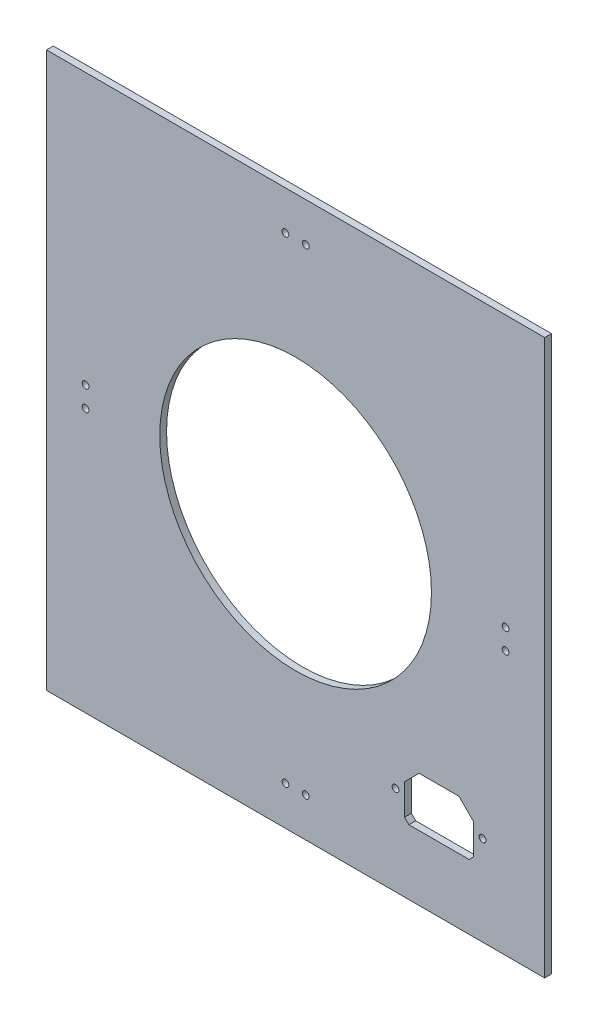
ISO-10303-21;
HEADER;
FILE_DESCRIPTION(('STEP AP214'),'2;1');
FILE_NAME('part.step','',(''),(''),'','','');
FILE_SCHEMA(('AUTOMOTIVE_DESIGN { 1 0 10303 214 1 1 1 1 }'));
ENDSEC;
DATA;
#1=APPLICATION_CONTEXT('core data for automotive mechanical design processes');
#2=APPLICATION_PROTOCOL_DEFINITION('international standard','automotive_design',2000,#1);
#3=PRODUCT_CONTEXT('',#1,'mechanical');
#4=PRODUCT('Part','Part','',(#3));
#5=PRODUCT_RELATED_PRODUCT_CATEGORY('part','',(#4));
#6=PRODUCT_DEFINITION_FORMATION('','',#4);
#7=PRODUCT_DEFINITION_CONTEXT('part definition',#1,'design');
#8=PRODUCT_DEFINITION('design','',#6,#7);
#9=PRODUCT_DEFINITION_SHAPE('','',#8);
#10=(LENGTH_UNIT() NAMED_UNIT(*) SI_UNIT(.MILLI.,.METRE.));
#11=(NAMED_UNIT(*) PLANE_ANGLE_UNIT() SI_UNIT($,.RADIAN.));
#12=(NAMED_UNIT(*) SI_UNIT($,.STERADIAN.) SOLID_ANGLE_UNIT());
#13=UNCERTAINTY_MEASURE_WITH_UNIT(LENGTH_MEASURE(1.E-05),#10,'distance_accuracy_value','');
#14=(GEOMETRIC_REPRESENTATION_CONTEXT(3) GLOBAL_UNCERTAINTY_ASSIGNED_CONTEXT((#13)) GLOBAL_UNIT_ASSIGNED_CONTEXT((#10,
#11,#12)) REPRESENTATION_CONTEXT('',''));
#15=CARTESIAN_POINT('',(0.,0.,0.));
#16=DIRECTION('',(0.,0.,1.));
#17=DIRECTION('',(1.,0.,0.));
#18=AXIS2_PLACEMENT_3D('',#15,#16,#17);
#19=CARTESIAN_POINT('',(0.,0.,3.));
#20=DIRECTION('',(0.,0.,-1.));
#21=DIRECTION('',(-1.,0.,0.));
#22=AXIS2_PLACEMENT_3D('',#19,#20,#21);
#23=PLANE('',#22);
#24=CARTESIAN_POINT('',(-12.2529511768823,-1.47301526717697,3.));
#25=DIRECTION('',(0.,0.,-1.));
#26=DIRECTION('',(-1.,0.,0.));
#27=AXIS2_PLACEMENT_3D('',#24,#25,#26);
#28=CIRCLE('',#27,1.49999999999997);
#29=CARTESIAN_POINT('',(-13.7529511768823,-1.47301526717697,3.));
#30=VERTEX_POINT('',#29);
#31=EDGE_CURVE('E155',#30,#30,#28,.F.);
#32=ORIENTED_EDGE('',*,*,#31,.F.);
#33=EDGE_LOOP('',(#32));
#34=FACE_BOUND('',#33,.T.);
#35=CARTESIAN_POINT('',(-109.5,-100.705064090293,3.));
#36=DIRECTION('',(0.,0.,-1.));
#37=DIRECTION('',(-1.,0.,0.));
#38=AXIS2_PLACEMENT_3D('',#35,#36,#37);
#39=CIRCLE('',#38,1.49999999999997);
#40=CARTESIAN_POINT('',(-111.,-100.705064090293,3.));
#41=VERTEX_POINT('',#40);
#42=EDGE_CURVE('E267',#41,#41,#39,.T.);
#43=ORIENTED_EDGE('',*,*,#42,.T.);
#44=EDGE_LOOP('',(#43));
#45=FACE_BOUND('',#44,.T.);
#46=CARTESIAN_POINT('',(-197.747048823118,-1.47301526717697,3.));
#47=DIRECTION('',(0.,0.,-1.));
#48=DIRECTION('',(-1.,0.,0.));
#49=AXIS2_PLACEMENT_3D('',#46,#47,#48);
#50=CIRCLE('',#49,1.49999999999997);
#51=CARTESIAN_POINT('',(-199.247048823118,-1.47301526717697,3.));
#52=VERTEX_POINT('',#51);
#53=EDGE_CURVE('E272',#52,#52,#50,.T.);
#54=ORIENTED_EDGE('',*,*,#53,.T.);
#55=EDGE_LOOP('',(#54));
#56=FACE_BOUND('',#55,.T.);
#57=CARTESIAN_POINT('',(-109.5,109.789033555942,3.));
#58=DIRECTION('',(0.,0.,-1.));
#59=DIRECTION('',(-1.,0.,0.));
#60=AXIS2_PLACEMENT_3D('',#57,#58,#59);
#61=CIRCLE('',#60,1.49999999999997);
#62=CARTESIAN_POINT('',(-111.,109.789033555942,3.));
#63=VERTEX_POINT('',#62);
#64=EDGE_CURVE('E275',#63,#63,#61,.F.);
#65=ORIENTED_EDGE('',*,*,#64,.F.);
#66=EDGE_LOOP('',(#65));
#67=FACE_BOUND('',#66,.T.);
#68=CARTESIAN_POINT('',(-100.5,109.789033555942,3.));
#69=DIRECTION('',(0.,0.,-1.));
#70=DIRECTION('',(-1.,0.,0.));
#71=AXIS2_PLACEMENT_3D('',#68,#69,#70);
#72=CIRCLE('',#71,1.49999999999997);
#73=CARTESIAN_POINT('',(-102.,109.789033555942,3.));
#74=VERTEX_POINT('',#73);
#75=EDGE_CURVE('E278',#74,#74,#72,.F.);
#76=ORIENTED_EDGE('',*,*,#75,.F.);
#77=EDGE_LOOP('',(#76));
#78=FACE_BOUND('',#77,.T.);
#79=CARTESIAN_POINT('',(-12.2529511768823,7.52698473282304,3.));
#80=DIRECTION('',(0.,0.,-1.));
#81=DIRECTION('',(-1.,0.,0.));
#82=AXIS2_PLACEMENT_3D('',#79,#80,#81);
#83=CIRCLE('',#82,1.49999999999997);
#84=CARTESIAN_POINT('',(-13.7529511768823,7.52698473282304,3.));
#85=VERTEX_POINT('',#84);
#86=EDGE_CURVE('E281',#85,#85,#83,.F.);
#87=ORIENTED_EDGE('',*,*,#86,.F.);
#88=EDGE_LOOP('',(#87));
#89=FACE_BOUND('',#88,.T.);
#90=CARTESIAN_POINT('',(-60.8634487757194,-78.3416070210696,3.));
#91=DIRECTION('',(0.,0.,1.));
#92=DIRECTION('',(1.,0.,0.));
#93=AXIS2_PLACEMENT_3D('',#90,#91,#92);
#94=CIRCLE('',#93,1.5);
#95=CARTESIAN_POINT('',(-59.3634487757194,-78.3416070210696,3.));
#96=VERTEX_POINT('',#95);
#97=EDGE_CURVE('E177',#96,#96,#94,.T.);
#98=ORIENTED_EDGE('',*,*,#97,.F.);
#99=EDGE_LOOP('',(#98));
#100=FACE_BOUND('',#99,.T.);
#101=CARTESIAN_POINT('',(-22.442633495548,-78.3416070210696,3.));
#102=DIRECTION('',(0.,0.,1.));
#103=DIRECTION('',(1.,0.,0.));
#104=AXIS2_PLACEMENT_3D('',#101,#102,#103);
#105=CIRCLE('',#104,1.5);
#106=CARTESIAN_POINT('',(-20.942633495548,-78.3416070210696,3.));
#107=VERTEX_POINT('',#106);
#108=EDGE_CURVE('E173',#107,#107,#105,.T.);
#109=ORIENTED_EDGE('',*,*,#108,.F.);
#110=EDGE_LOOP('',(#109));
#111=FACE_BOUND('',#110,.T.);
#112=DIRECTION('',(1.,0.,0.));
#113=VECTOR('',#112,1.);
#114=CARTESIAN_POINT('',(-210.,-117.958015267176,3.));
#115=LINE('',#114,#113);
#116=CARTESIAN_POINT('',(-215.,-117.958015267176,3.));
#117=VERTEX_POINT('',#116);
#118=CARTESIAN_POINT('',(5.,-117.958015267176,3.));
#119=VERTEX_POINT('',#118);
#120=EDGE_CURVE('E11',#117,#119,#115,.T.);
#121=ORIENTED_EDGE('',*,*,#120,.T.);
#122=DIRECTION('',(0.,-1.,0.));
#123=VECTOR('',#122,1.);
#124=CARTESIAN_POINT('',(5.,127.041984732824,3.));
#125=LINE('',#124,#123);
#126=CARTESIAN_POINT('',(5.,127.041984732824,3.));
#127=VERTEX_POINT('',#126);
#128=EDGE_CURVE('E170',#127,#119,#125,.T.);
#129=ORIENTED_EDGE('',*,*,#128,.F.);
#130=DIRECTION('',(-1.,0.,0.));
#131=VECTOR('',#130,1.);
#132=CARTESIAN_POINT('',(-210.,127.041984732824,3.));
#133=LINE('',#132,#131);
#134=CARTESIAN_POINT('',(-215.,127.041984732824,3.));
#135=VERTEX_POINT('',#134);
#136=EDGE_CURVE('E50',#127,#135,#133,.T.);
#137=ORIENTED_EDGE('',*,*,#136,.T.);
#138=DIRECTION('',(0.,1.,0.));
#139=VECTOR('',#138,1.);
#140=CARTESIAN_POINT('',(-215.,-117.958015267176,3.));
#141=LINE('',#140,#139);
#142=EDGE_CURVE('E154',#117,#135,#141,.T.);
#143=ORIENTED_EDGE('',*,*,#142,.F.);
#144=EDGE_LOOP('',(#121,#129,#137,#143));
#145=FACE_BOUND('',#144,.T.);
#146=CARTESIAN_POINT('',(-105.,4.54198473282444,3.));
#147=DIRECTION('',(0.,0.,1.));
#148=DIRECTION('',(1.,0.,0.));
#149=AXIS2_PLACEMENT_3D('',#146,#147,#148);
#150=CIRCLE('',#149,60.);
#151=CARTESIAN_POINT('',(-45.,4.54198473282444,3.));
#152=VERTEX_POINT('',#151);
#153=EDGE_CURVE('E227',#152,#152,#150,.T.);
#154=ORIENTED_EDGE('',*,*,#153,.F.);
#155=EDGE_LOOP('',(#154));
#156=FACE_BOUND('',#155,.T.);
#157=DIRECTION('',(-1.,0.,0.));
#158=VECTOR('',#157,1.);
#159=CARTESIAN_POINT('',(0.,-89.3020146611552,3.));
#160=LINE('',#159,#158);
#161=CARTESIAN_POINT('',(-28.3630916419725,-89.3020146611552,3.));
#162=VERTEX_POINT('',#161);
#163=CARTESIAN_POINT('',(-54.942990629295,-89.3020146611553,3.));
#164=VERTEX_POINT('',#163);
#165=EDGE_CURVE('E58',#162,#164,#160,.T.);
#166=ORIENTED_EDGE('',*,*,#165,.T.);
#167=DIRECTION('',(-0.707106781186545,0.70710678118655,0.));
#168=VECTOR('',#167,1.);
#169=CARTESIAN_POINT('',(-72.1225026452253,-72.1225026452248,3.));
#170=LINE('',#169,#168);
#171=CARTESIAN_POINT('',(-56.8634487757194,-87.3815565147308,3.));
#172=VERTEX_POINT('',#171);
#173=EDGE_CURVE('E188',#164,#172,#170,.T.);
#174=ORIENTED_EDGE('',*,*,#173,.T.);
#175=DIRECTION('',(0.,1.,0.));
#176=VECTOR('',#175,1.);
#177=CARTESIAN_POINT('',(-56.8634487757194,0.,3.));
#178=LINE('',#177,#176);
#179=CARTESIAN_POINT('',(-56.8634487757194,-73.8016575274085,3.));
#180=VERTEX_POINT('',#179);
#181=EDGE_CURVE('E220',#172,#180,#178,.T.);
#182=ORIENTED_EDGE('',*,*,#181,.T.);
#183=DIRECTION('',(0.707106781186548,0.707106781186548,0.));
#184=VECTOR('',#183,1.);
#185=CARTESIAN_POINT('',(8.46910437584453,-8.46910437584453,3.));
#186=LINE('',#185,#184);
#187=CARTESIAN_POINT('',(-50.4429906292949,-67.381199380984,3.));
#188=VERTEX_POINT('',#187);
#189=EDGE_CURVE('E217',#180,#188,#186,.T.);
#190=ORIENTED_EDGE('',*,*,#189,.T.);
#191=DIRECTION('',(1.,0.,0.));
#192=VECTOR('',#191,1.);
#193=CARTESIAN_POINT('',(0.,-67.381199380984,3.));
#194=LINE('',#193,#192);
#195=CARTESIAN_POINT('',(-32.8630916419725,-67.381199380984,3.));
#196=VERTEX_POINT('',#195);
#197=EDGE_CURVE('E214',#188,#196,#194,.T.);
#198=ORIENTED_EDGE('',*,*,#197,.T.);
#199=DIRECTION('',(-0.707106781186547,0.707106781186548,0.));
#200=VECTOR('',#199,1.);
#201=CARTESIAN_POINT('',(-50.1221455114783,-50.1221455114782,3.));
#202=LINE('',#201,#200);
#203=CARTESIAN_POINT('',(-26.442633495548,-73.8016575274085,3.));
#204=VERTEX_POINT('',#203);
#205=EDGE_CURVE('E211',#204,#196,#202,.T.);
#206=ORIENTED_EDGE('',*,*,#205,.F.);
#207=DIRECTION('',(0.,1.,0.));
#208=VECTOR('',#207,1.);
#209=CARTESIAN_POINT('',(-26.442633495548,0.,3.));
#210=LINE('',#209,#208);
#211=CARTESIAN_POINT('',(-26.442633495548,-87.3815565147308,3.));
#212=VERTEX_POINT('',#211);
#213=EDGE_CURVE('E208',#212,#204,#210,.T.);
#214=ORIENTED_EDGE('',*,*,#213,.F.);
#215=DIRECTION('',(0.707106781186548,0.707106781186548,0.));
#216=VECTOR('',#215,1.);
#217=CARTESIAN_POINT('',(30.4694615095914,-30.4694615095914,3.));
#218=LINE('',#217,#216);
#219=EDGE_CURVE('E205',#162,#212,#218,.T.);
#220=ORIENTED_EDGE('',*,*,#219,.F.);
#221=EDGE_LOOP('',(#166,#174,#182,#190,#198,#206,#214,#220));
#222=FACE_BOUND('',#221,.T.);
#223=CARTESIAN_POINT('',(-197.747048823118,7.52698473282304,3.));
#224=DIRECTION('',(0.,0.,-1.));
#225=DIRECTION('',(-1.,0.,0.));
#226=AXIS2_PLACEMENT_3D('',#223,#224,#225);
#227=CIRCLE('',#226,1.49999999999997);
#228=CARTESIAN_POINT('',(-199.247048823118,7.52698473282304,3.));
#229=VERTEX_POINT('',#228);
#230=EDGE_CURVE('E263',#229,#229,#227,.T.);
#231=ORIENTED_EDGE('',*,*,#230,.T.);
#232=EDGE_LOOP('',(#231));
#233=FACE_BOUND('',#232,.T.);
#234=CARTESIAN_POINT('',(-100.5,-100.705064090293,3.));
#235=DIRECTION('',(0.,0.,-1.));
#236=DIRECTION('',(-1.,0.,0.));
#237=AXIS2_PLACEMENT_3D('',#234,#235,#236);
#238=CIRCLE('',#237,1.49999999999997);
#239=CARTESIAN_POINT('',(-102.,-100.705064090293,3.));
#240=VERTEX_POINT('',#239);
#241=EDGE_CURVE('E158',#240,#240,#238,.T.);
#242=ORIENTED_EDGE('',*,*,#241,.T.);
#243=EDGE_LOOP('',(#242));
#244=FACE_BOUND('',#243,.T.);
#245=ADVANCED_FACE('F41',(#34,#45,#56,#67,#78,#89,#100,#111,#145,#156,#222,#233,#244),#23,.F.);
#246=CARTESIAN_POINT('',(0.,0.,0.));
#247=DIRECTION('',(0.,0.,-1.));
#248=DIRECTION('',(-1.,0.,0.));
#249=AXIS2_PLACEMENT_3D('',#246,#247,#248);
#250=PLANE('',#249);
#251=CARTESIAN_POINT('',(-12.2529511768823,-1.47301526717697,0.));
#252=DIRECTION('',(0.,0.,-1.));
#253=DIRECTION('',(-1.,0.,0.));
#254=AXIS2_PLACEMENT_3D('',#251,#252,#253);
#255=CIRCLE('',#254,1.49999999999997);
#256=CARTESIAN_POINT('',(-13.7529511768823,-1.47301526717697,0.));
#257=VERTEX_POINT('',#256);
#258=EDGE_CURVE('E287',#257,#257,#255,.F.);
#259=ORIENTED_EDGE('',*,*,#258,.T.);
#260=EDGE_LOOP('',(#259));
#261=FACE_BOUND('',#260,.T.);
#262=CARTESIAN_POINT('',(-109.5,109.789033555942,0.));
#263=DIRECTION('',(0.,0.,-1.));
#264=DIRECTION('',(-1.,0.,0.));
#265=AXIS2_PLACEMENT_3D('',#262,#263,#264);
#266=CIRCLE('',#265,1.49999999999997);
#267=CARTESIAN_POINT('',(-111.,109.789033555942,0.));
#268=VERTEX_POINT('',#267);
#269=EDGE_CURVE('E303',#268,#268,#266,.F.);
#270=ORIENTED_EDGE('',*,*,#269,.T.);
#271=EDGE_LOOP('',(#270));
#272=FACE_BOUND('',#271,.T.);
#273=CARTESIAN_POINT('',(-100.5,109.789033555942,0.));
#274=DIRECTION('',(0.,0.,-1.));
#275=DIRECTION('',(-1.,0.,0.));
#276=AXIS2_PLACEMENT_3D('',#273,#274,#275);
#277=CIRCLE('',#276,1.49999999999997);
#278=CARTESIAN_POINT('',(-102.,109.789033555942,0.));
#279=VERTEX_POINT('',#278);
#280=EDGE_CURVE('E300',#279,#279,#277,.F.);
#281=ORIENTED_EDGE('',*,*,#280,.T.);
#282=EDGE_LOOP('',(#281));
#283=FACE_BOUND('',#282,.T.);
#284=CARTESIAN_POINT('',(-12.2529511768823,7.52698473282304,0.));
#285=DIRECTION('',(0.,0.,-1.));
#286=DIRECTION('',(-1.,0.,0.));
#287=AXIS2_PLACEMENT_3D('',#284,#285,#286);
#288=CIRCLE('',#287,1.49999999999997);
#289=CARTESIAN_POINT('',(-13.7529511768823,7.52698473282304,0.));
#290=VERTEX_POINT('',#289);
#291=EDGE_CURVE('E284',#290,#290,#288,.F.);
#292=ORIENTED_EDGE('',*,*,#291,.T.);
#293=EDGE_LOOP('',(#292));
#294=FACE_BOUND('',#293,.T.);
#295=CARTESIAN_POINT('',(-60.8634487757194,-78.3416070210696,0.));
#296=DIRECTION('',(0.,0.,1.));
#297=DIRECTION('',(1.,0.,0.));
#298=AXIS2_PLACEMENT_3D('',#295,#296,#297);
#299=CIRCLE('',#298,1.5);
#300=CARTESIAN_POINT('',(-59.3634487757194,-78.3416070210696,0.));
#301=VERTEX_POINT('',#300);
#302=EDGE_CURVE('E174',#301,#301,#299,.T.);
#303=ORIENTED_EDGE('',*,*,#302,.T.);
#304=EDGE_LOOP('',(#303));
#305=FACE_BOUND('',#304,.T.);
#306=CARTESIAN_POINT('',(-22.442633495548,-78.3416070210696,0.));
#307=DIRECTION('',(0.,0.,1.));
#308=DIRECTION('',(1.,0.,0.));
#309=AXIS2_PLACEMENT_3D('',#306,#307,#308);
#310=CIRCLE('',#309,1.5);
#311=CARTESIAN_POINT('',(-20.942633495548,-78.3416070210696,0.));
#312=VERTEX_POINT('',#311);
#313=EDGE_CURVE('E180',#312,#312,#310,.T.);
#314=ORIENTED_EDGE('',*,*,#313,.T.);
#315=EDGE_LOOP('',(#314));
#316=FACE_BOUND('',#315,.T.);
#317=CARTESIAN_POINT('',(-105.,4.54198473282444,0.));
#318=DIRECTION('',(0.,0.,1.));
#319=DIRECTION('',(1.,0.,0.));
#320=AXIS2_PLACEMENT_3D('',#317,#318,#319);
#321=CIRCLE('',#320,60.);
#322=CARTESIAN_POINT('',(-45.,4.54198473282444,0.));
#323=VERTEX_POINT('',#322);
#324=EDGE_CURVE('E141',#323,#323,#321,.T.);
#325=ORIENTED_EDGE('',*,*,#324,.T.);
#326=EDGE_LOOP('',(#325));
#327=FACE_BOUND('',#326,.T.);
#328=DIRECTION('',(-1.,0.,0.));
#329=VECTOR('',#328,1.);
#330=CARTESIAN_POINT('',(-210.,127.041984732824,0.));
#331=LINE('',#330,#329);
#332=CARTESIAN_POINT('',(5.,127.041984732824,0.));
#333=VERTEX_POINT('',#332);
#334=CARTESIAN_POINT('',(-215.,127.041984732824,0.));
#335=VERTEX_POINT('',#334);
#336=EDGE_CURVE('E132',#333,#335,#331,.T.);
#337=ORIENTED_EDGE('',*,*,#336,.F.);
#338=DIRECTION('',(0.,1.,0.));
#339=VECTOR('',#338,1.);
#340=CARTESIAN_POINT('',(5.,-117.958015267176,0.));
#341=LINE('',#340,#339);
#342=CARTESIAN_POINT('',(5.,-117.958015267176,0.));
#343=VERTEX_POINT('',#342);
#344=EDGE_CURVE('E167',#343,#333,#341,.T.);
#345=ORIENTED_EDGE('',*,*,#344,.F.);
#346=DIRECTION('',(1.,0.,0.));
#347=VECTOR('',#346,1.);
#348=CARTESIAN_POINT('',(-210.,-117.958015267176,0.));
#349=LINE('',#348,#347);
#350=CARTESIAN_POINT('',(-215.,-117.958015267176,0.));
#351=VERTEX_POINT('',#350);
#352=EDGE_CURVE('E45',#351,#343,#349,.T.);
#353=ORIENTED_EDGE('',*,*,#352,.F.);
#354=DIRECTION('',(0.,-1.,0.));
#355=VECTOR('',#354,1.);
#356=CARTESIAN_POINT('',(-215.,127.041984732824,0.));
#357=LINE('',#356,#355);
#358=EDGE_CURVE('E143',#335,#351,#357,.T.);
#359=ORIENTED_EDGE('',*,*,#358,.F.);
#360=EDGE_LOOP('',(#337,#345,#353,#359));
#361=FACE_BOUND('',#360,.T.);
#362=DIRECTION('',(-0.707106781186545,0.70710678118655,0.));
#363=VECTOR('',#362,1.);
#364=CARTESIAN_POINT('',(-72.1225026452253,-72.1225026452248,0.));
#365=LINE('',#364,#363);
#366=CARTESIAN_POINT('',(-54.942990629295,-89.3020146611553,0.));
#367=VERTEX_POINT('',#366);
#368=CARTESIAN_POINT('',(-56.8634487757194,-87.3815565147308,0.));
#369=VERTEX_POINT('',#368);
#370=EDGE_CURVE('E201',#367,#369,#365,.T.);
#371=ORIENTED_EDGE('',*,*,#370,.F.);
#372=DIRECTION('',(-1.,0.,0.));
#373=VECTOR('',#372,1.);
#374=CARTESIAN_POINT('',(0.,-89.3020146611552,0.));
#375=LINE('',#374,#373);
#376=CARTESIAN_POINT('',(-28.3630916419725,-89.3020146611552,0.));
#377=VERTEX_POINT('',#376);
#378=EDGE_CURVE('E185',#377,#367,#375,.T.);
#379=ORIENTED_EDGE('',*,*,#378,.F.);
#380=DIRECTION('',(0.707106781186548,0.707106781186548,0.));
#381=VECTOR('',#380,1.);
#382=CARTESIAN_POINT('',(30.4694615095914,-30.4694615095914,0.));
#383=LINE('',#382,#381);
#384=CARTESIAN_POINT('',(-26.442633495548,-87.3815565147308,0.));
#385=VERTEX_POINT('',#384);
#386=EDGE_CURVE('E187',#377,#385,#383,.T.);
#387=ORIENTED_EDGE('',*,*,#386,.T.);
#388=DIRECTION('',(0.,1.,0.));
#389=VECTOR('',#388,1.);
#390=CARTESIAN_POINT('',(-26.442633495548,0.,0.));
#391=LINE('',#390,#389);
#392=CARTESIAN_POINT('',(-26.442633495548,-73.8016575274085,0.));
#393=VERTEX_POINT('',#392);
#394=EDGE_CURVE('E66',#385,#393,#391,.T.);
#395=ORIENTED_EDGE('',*,*,#394,.T.);
#396=DIRECTION('',(-0.707106781186547,0.707106781186548,0.));
#397=VECTOR('',#396,1.);
#398=CARTESIAN_POINT('',(-50.1221455114783,-50.1221455114782,0.));
#399=LINE('',#398,#397);
#400=CARTESIAN_POINT('',(-32.8630916419725,-67.381199380984,0.));
#401=VERTEX_POINT('',#400);
#402=EDGE_CURVE('E192',#393,#401,#399,.T.);
#403=ORIENTED_EDGE('',*,*,#402,.T.);
#404=DIRECTION('',(1.,0.,0.));
#405=VECTOR('',#404,1.);
#406=CARTESIAN_POINT('',(0.,-67.381199380984,0.));
#407=LINE('',#406,#405);
#408=CARTESIAN_POINT('',(-50.4429906292949,-67.381199380984,0.));
#409=VERTEX_POINT('',#408);
#410=EDGE_CURVE('E195',#409,#401,#407,.T.);
#411=ORIENTED_EDGE('',*,*,#410,.F.);
#412=DIRECTION('',(0.707106781186548,0.707106781186548,0.));
#413=VECTOR('',#412,1.);
#414=CARTESIAN_POINT('',(8.46910437584453,-8.46910437584453,0.));
#415=LINE('',#414,#413);
#416=CARTESIAN_POINT('',(-56.8634487757194,-73.8016575274085,0.));
#417=VERTEX_POINT('',#416);
#418=EDGE_CURVE('E197',#417,#409,#415,.T.);
#419=ORIENTED_EDGE('',*,*,#418,.F.);
#420=DIRECTION('',(0.,1.,0.));
#421=VECTOR('',#420,1.);
#422=CARTESIAN_POINT('',(-56.8634487757194,0.,0.));
#423=LINE('',#422,#421);
#424=EDGE_CURVE('E199',#369,#417,#423,.T.);
#425=ORIENTED_EDGE('',*,*,#424,.F.);
#426=EDGE_LOOP('',(#371,#379,#387,#395,#403,#411,#419,#425));
#427=FACE_BOUND('',#426,.T.);
#428=CARTESIAN_POINT('',(-197.747048823118,-1.47301526717697,0.));
#429=DIRECTION('',(0.,0.,-1.));
#430=DIRECTION('',(-1.,0.,0.));
#431=AXIS2_PLACEMENT_3D('',#428,#429,#430);
#432=CIRCLE('',#431,1.49999999999997);
#433=CARTESIAN_POINT('',(-199.247048823118,-1.47301526717697,0.));
#434=VERTEX_POINT('',#433);
#435=EDGE_CURVE('E292',#434,#434,#432,.T.);
#436=ORIENTED_EDGE('',*,*,#435,.F.);
#437=EDGE_LOOP('',(#436));
#438=FACE_BOUND('',#437,.T.);
#439=CARTESIAN_POINT('',(-197.747048823118,7.52698473282304,0.));
#440=DIRECTION('',(0.,0.,-1.));
#441=DIRECTION('',(-1.,0.,0.));
#442=AXIS2_PLACEMENT_3D('',#439,#440,#441);
#443=CIRCLE('',#442,1.49999999999997);
#444=CARTESIAN_POINT('',(-199.247048823118,7.52698473282304,0.));
#445=VERTEX_POINT('',#444);
#446=EDGE_CURVE('E288',#445,#445,#443,.T.);
#447=ORIENTED_EDGE('',*,*,#446,.F.);
#448=EDGE_LOOP('',(#447));
#449=FACE_BOUND('',#448,.T.);
#450=CARTESIAN_POINT('',(-109.5,-100.705064090293,0.));
#451=DIRECTION('',(0.,0.,-1.));
#452=DIRECTION('',(-1.,0.,0.));
#453=AXIS2_PLACEMENT_3D('',#450,#451,#452);
#454=CIRCLE('',#453,1.49999999999997);
#455=CARTESIAN_POINT('',(-111.,-100.705064090293,0.));
#456=VERTEX_POINT('',#455);
#457=EDGE_CURVE('E291',#456,#456,#454,.T.);
#458=ORIENTED_EDGE('',*,*,#457,.F.);
#459=EDGE_LOOP('',(#458));
#460=FACE_BOUND('',#459,.T.);
#461=CARTESIAN_POINT('',(-100.5,-100.705064090293,0.));
#462=DIRECTION('',(0.,0.,-1.));
#463=DIRECTION('',(-1.,0.,0.));
#464=AXIS2_PLACEMENT_3D('',#461,#462,#463);
#465=CIRCLE('',#464,1.49999999999997);
#466=CARTESIAN_POINT('',(-102.,-100.705064090293,0.));
#467=VERTEX_POINT('',#466);
#468=EDGE_CURVE('E295',#467,#467,#465,.T.);
#469=ORIENTED_EDGE('',*,*,#468,.F.);
#470=EDGE_LOOP('',(#469));
#471=FACE_BOUND('',#470,.T.);
#472=ADVANCED_FACE('F144',(#261,#272,#283,#294,#305,#316,#327,#361,#427,#438,#449,#460,#471),
#250,.T.);
#473=CARTESIAN_POINT('',(-210.,127.041984732824,3.));
#474=DIRECTION('',(0.,-1.,0.));
#475=DIRECTION('',(0.,0.,-1.));
#476=AXIS2_PLACEMENT_3D('',#473,#474,#475);
#477=PLANE('',#476);
#478=ORIENTED_EDGE('',*,*,#336,.T.);
#479=DIRECTION('',(0.,0.,-1.));
#480=VECTOR('',#479,1.);
#481=CARTESIAN_POINT('',(-215.,127.041984732824,3.));
#482=LINE('',#481,#480);
#483=EDGE_CURVE('E135',#135,#335,#482,.T.);
#484=ORIENTED_EDGE('',*,*,#483,.F.);
#485=ORIENTED_EDGE('',*,*,#136,.F.);
#486=DIRECTION('',(0.,0.,1.));
#487=VECTOR('',#486,1.);
#488=CARTESIAN_POINT('',(5.,127.041984732824,0.));
#489=LINE('',#488,#487);
#490=EDGE_CURVE('E137',#333,#127,#489,.T.);
#491=ORIENTED_EDGE('',*,*,#490,.F.);
#492=EDGE_LOOP('',(#478,#484,#485,#491));
#493=FACE_BOUND('',#492,.T.);
#494=ADVANCED_FACE('F43',(#493),#477,.F.);
#495=CARTESIAN_POINT('',(-210.,-117.958015267176,3.));
#496=DIRECTION('',(0.,1.,0.));
#497=DIRECTION('',(0.,0.,1.));
#498=AXIS2_PLACEMENT_3D('',#495,#496,#497);
#499=PLANE('',#498);
#500=ORIENTED_EDGE('',*,*,#352,.T.);
#501=DIRECTION('',(0.,0.,-1.));
#502=VECTOR('',#501,1.);
#503=CARTESIAN_POINT('',(5.,-117.958015267176,3.));
#504=LINE('',#503,#502);
#505=EDGE_CURVE('E164',#119,#343,#504,.T.);
#506=ORIENTED_EDGE('',*,*,#505,.F.);
#507=ORIENTED_EDGE('',*,*,#120,.F.);
#508=DIRECTION('',(0.,0.,1.));
#509=VECTOR('',#508,1.);
#510=CARTESIAN_POINT('',(-215.,-117.958015267176,0.));
#511=LINE('',#510,#509);
#512=EDGE_CURVE('E149',#351,#117,#511,.T.);
#513=ORIENTED_EDGE('',*,*,#512,.F.);
#514=EDGE_LOOP('',(#500,#506,#507,#513));
#515=FACE_BOUND('',#514,.T.);
#516=ADVANCED_FACE('F249',(#515),#499,.F.);
#517=CARTESIAN_POINT('',(-105.,4.54198473282444,0.));
#518=DIRECTION('',(0.,0.,1.));
#519=DIRECTION('',(1.,0.,0.));
#520=AXIS2_PLACEMENT_3D('',#517,#518,#519);
#521=CYLINDRICAL_SURFACE('',#520,60.);
#522=ORIENTED_EDGE('',*,*,#324,.F.);
#523=EDGE_LOOP('',(#522));
#524=FACE_BOUND('',#523,.T.);
#525=ORIENTED_EDGE('',*,*,#153,.T.);
#526=EDGE_LOOP('',(#525));
#527=FACE_BOUND('',#526,.T.);
#528=ADVANCED_FACE('F388',(#524,#527),#521,.F.);
#529=CARTESIAN_POINT('',(0.,-89.3020146611552,0.));
#530=DIRECTION('',(0.,1.,0.));
#531=DIRECTION('',(-1.,0.,0.));
#532=AXIS2_PLACEMENT_3D('',#529,#530,#531);
#533=PLANE('',#532);
#534=ORIENTED_EDGE('',*,*,#165,.F.);
#535=DIRECTION('',(0.,0.,1.));
#536=VECTOR('',#535,1.);
#537=CARTESIAN_POINT('',(-28.3630916419725,-89.3020146611552,0.));
#538=LINE('',#537,#536);
#539=EDGE_CURVE('E203',#377,#162,#538,.T.);
#540=ORIENTED_EDGE('',*,*,#539,.F.);
#541=ORIENTED_EDGE('',*,*,#378,.T.);
#542=DIRECTION('',(0.,0.,1.));
#543=VECTOR('',#542,1.);
#544=CARTESIAN_POINT('',(-54.942990629295,-89.3020146611553,0.));
#545=LINE('',#544,#543);
#546=EDGE_CURVE('E225',#367,#164,#545,.T.);
#547=ORIENTED_EDGE('',*,*,#546,.T.);
#548=EDGE_LOOP('',(#534,#540,#541,#547));
#549=FACE_BOUND('',#548,.T.);
#550=ADVANCED_FACE('F363',(#549),#533,.T.);
#551=CARTESIAN_POINT('',(-72.1225026452253,-72.1225026452248,0.));
#552=DIRECTION('',(0.70710678118655,0.707106781186545,0.));
#553=DIRECTION('',(-0.707106781186545,0.70710678118655,0.));
#554=AXIS2_PLACEMENT_3D('',#551,#552,#553);
#555=PLANE('',#554);
#556=ORIENTED_EDGE('',*,*,#173,.F.);
#557=ORIENTED_EDGE('',*,*,#546,.F.);
#558=ORIENTED_EDGE('',*,*,#370,.T.);
#559=DIRECTION('',(0.,0.,1.));
#560=VECTOR('',#559,1.);
#561=CARTESIAN_POINT('',(-56.8634487757194,-87.3815565147308,0.));
#562=LINE('',#561,#560);
#563=EDGE_CURVE('E228',#369,#172,#562,.T.);
#564=ORIENTED_EDGE('',*,*,#563,.T.);
#565=EDGE_LOOP('',(#556,#557,#558,#564));
#566=FACE_BOUND('',#565,.T.);
#567=ADVANCED_FACE('F359',(#566),#555,.T.);
#568=CARTESIAN_POINT('',(-56.8634487757194,0.,0.));
#569=DIRECTION('',(1.,0.,0.));
#570=DIRECTION('',(0.,0.,-1.));
#571=AXIS2_PLACEMENT_3D('',#568,#569,#570);
#572=PLANE('',#571);
#573=ORIENTED_EDGE('',*,*,#181,.F.);
#574=ORIENTED_EDGE('',*,*,#563,.F.);
#575=ORIENTED_EDGE('',*,*,#424,.T.);
#576=DIRECTION('',(0.,0.,1.));
#577=VECTOR('',#576,1.);
#578=CARTESIAN_POINT('',(-56.8634487757194,-73.8016575274085,0.));
#579=LINE('',#578,#577);
#580=EDGE_CURVE('E230',#417,#180,#579,.T.);
#581=ORIENTED_EDGE('',*,*,#580,.T.);
#582=EDGE_LOOP('',(#573,#574,#575,#581));
#583=FACE_BOUND('',#582,.T.);
#584=ADVANCED_FACE('F362',(#583),#572,.T.);
#585=CARTESIAN_POINT('',(8.46910437584453,-8.46910437584453,0.));
#586=DIRECTION('',(0.707106781186547,-0.707106781186547,0.));
#587=DIRECTION('',(0.707106781186548,0.707106781186548,0.));
#588=AXIS2_PLACEMENT_3D('',#585,#586,#587);
#589=PLANE('',#588);
#590=ORIENTED_EDGE('',*,*,#189,.F.);
#591=ORIENTED_EDGE('',*,*,#580,.F.);
#592=ORIENTED_EDGE('',*,*,#418,.T.);
#593=DIRECTION('',(0.,0.,1.));
#594=VECTOR('',#593,1.);
#595=CARTESIAN_POINT('',(-50.4429906292949,-67.381199380984,0.));
#596=LINE('',#595,#594);
#597=EDGE_CURVE('E232',#409,#188,#596,.T.);
#598=ORIENTED_EDGE('',*,*,#597,.T.);
#599=EDGE_LOOP('',(#590,#591,#592,#598));
#600=FACE_BOUND('',#599,.T.);
#601=ADVANCED_FACE('F367',(#600),#589,.T.);
#602=CARTESIAN_POINT('',(0.,-67.381199380984,0.));
#603=DIRECTION('',(0.,-1.,0.));
#604=DIRECTION('',(0.,0.,-1.));
#605=AXIS2_PLACEMENT_3D('',#602,#603,#604);
#606=PLANE('',#605);
#607=ORIENTED_EDGE('',*,*,#197,.F.);
#608=ORIENTED_EDGE('',*,*,#597,.F.);
#609=ORIENTED_EDGE('',*,*,#410,.T.);
#610=DIRECTION('',(0.,0.,1.));
#611=VECTOR('',#610,1.);
#612=CARTESIAN_POINT('',(-32.8630916419725,-67.381199380984,0.));
#613=LINE('',#612,#611);
#614=EDGE_CURVE('E234',#401,#196,#613,.T.);
#615=ORIENTED_EDGE('',*,*,#614,.T.);
#616=EDGE_LOOP('',(#607,#608,#609,#615));
#617=FACE_BOUND('',#616,.T.);
#618=ADVANCED_FACE('F371',(#617),#606,.T.);
#619=CARTESIAN_POINT('',(-50.1221455114783,-50.1221455114782,0.));
#620=DIRECTION('',(0.707106781186548,0.707106781186547,0.));
#621=DIRECTION('',(-0.707106781186547,0.707106781186548,0.));
#622=AXIS2_PLACEMENT_3D('',#619,#620,#621);
#623=PLANE('',#622);
#624=ORIENTED_EDGE('',*,*,#205,.T.);
#625=ORIENTED_EDGE('',*,*,#614,.F.);
#626=ORIENTED_EDGE('',*,*,#402,.F.);
#627=DIRECTION('',(0.,0.,1.));
#628=VECTOR('',#627,1.);
#629=CARTESIAN_POINT('',(-26.442633495548,-73.8016575274085,0.));
#630=LINE('',#629,#628);
#631=EDGE_CURVE('E236',#393,#204,#630,.T.);
#632=ORIENTED_EDGE('',*,*,#631,.T.);
#633=EDGE_LOOP('',(#624,#625,#626,#632));
#634=FACE_BOUND('',#633,.T.);
#635=ADVANCED_FACE('F375',(#634),#623,.F.);
#636=CARTESIAN_POINT('',(-26.442633495548,0.,0.));
#637=DIRECTION('',(1.,0.,0.));
#638=DIRECTION('',(0.,0.,-1.));
#639=AXIS2_PLACEMENT_3D('',#636,#637,#638);
#640=PLANE('',#639);
#641=ORIENTED_EDGE('',*,*,#213,.T.);
#642=ORIENTED_EDGE('',*,*,#631,.F.);
#643=ORIENTED_EDGE('',*,*,#394,.F.);
#644=DIRECTION('',(0.,0.,1.));
#645=VECTOR('',#644,1.);
#646=CARTESIAN_POINT('',(-26.442633495548,-87.3815565147308,0.));
#647=LINE('',#646,#645);
#648=EDGE_CURVE('E238',#385,#212,#647,.T.);
#649=ORIENTED_EDGE('',*,*,#648,.T.);
#650=EDGE_LOOP('',(#641,#642,#643,#649));
#651=FACE_BOUND('',#650,.T.);
#652=ADVANCED_FACE('F379',(#651),#640,.F.);
#653=CARTESIAN_POINT('',(30.4694615095914,-30.4694615095914,0.));
#654=DIRECTION('',(0.707106781186547,-0.707106781186547,0.));
#655=DIRECTION('',(0.707106781186548,0.707106781186548,0.));
#656=AXIS2_PLACEMENT_3D('',#653,#654,#655);
#657=PLANE('',#656);
#658=ORIENTED_EDGE('',*,*,#219,.T.);
#659=ORIENTED_EDGE('',*,*,#648,.F.);
#660=ORIENTED_EDGE('',*,*,#386,.F.);
#661=ORIENTED_EDGE('',*,*,#539,.T.);
#662=EDGE_LOOP('',(#658,#659,#660,#661));
#663=FACE_BOUND('',#662,.T.);
#664=ADVANCED_FACE('F357',(#663),#657,.F.);
#665=CARTESIAN_POINT('',(-22.442633495548,-78.3416070210696,0.));
#666=DIRECTION('',(0.,0.,1.));
#667=DIRECTION('',(1.,0.,0.));
#668=AXIS2_PLACEMENT_3D('',#665,#666,#667);
#669=CYLINDRICAL_SURFACE('',#668,1.5);
#670=ORIENTED_EDGE('',*,*,#313,.F.);
#671=EDGE_LOOP('',(#670));
#672=FACE_BOUND('',#671,.T.);
#673=ORIENTED_EDGE('',*,*,#108,.T.);
#674=EDGE_LOOP('',(#673));
#675=FACE_BOUND('',#674,.T.);
#676=ADVANCED_FACE('F353',(#672,#675),#669,.F.);
#677=CARTESIAN_POINT('',(-60.8634487757194,-78.3416070210696,0.));
#678=DIRECTION('',(0.,0.,1.));
#679=DIRECTION('',(1.,0.,0.));
#680=AXIS2_PLACEMENT_3D('',#677,#678,#679);
#681=CYLINDRICAL_SURFACE('',#680,1.5);
#682=ORIENTED_EDGE('',*,*,#302,.F.);
#683=EDGE_LOOP('',(#682));
#684=FACE_BOUND('',#683,.T.);
#685=ORIENTED_EDGE('',*,*,#97,.T.);
#686=EDGE_LOOP('',(#685));
#687=FACE_BOUND('',#686,.T.);
#688=ADVANCED_FACE('F350',(#684,#687),#681,.F.);
#689=CARTESIAN_POINT('',(5.,0.,0.));
#690=DIRECTION('',(1.,0.,0.));
#691=DIRECTION('',(0.,0.,-1.));
#692=AXIS2_PLACEMENT_3D('',#689,#690,#691);
#693=PLANE('',#692);
#694=ORIENTED_EDGE('',*,*,#505,.T.);
#695=ORIENTED_EDGE('',*,*,#344,.T.);
#696=ORIENTED_EDGE('',*,*,#490,.T.);
#697=ORIENTED_EDGE('',*,*,#128,.T.);
#698=EDGE_LOOP('',(#694,#695,#696,#697));
#699=FACE_BOUND('',#698,.T.);
#700=ADVANCED_FACE('F251',(#699),#693,.T.);
#701=CARTESIAN_POINT('',(-215.,0.,0.));
#702=DIRECTION('',(-1.,0.,0.));
#703=DIRECTION('',(0.,0.,1.));
#704=AXIS2_PLACEMENT_3D('',#701,#702,#703);
#705=PLANE('',#704);
#706=ORIENTED_EDGE('',*,*,#483,.T.);
#707=ORIENTED_EDGE('',*,*,#358,.T.);
#708=ORIENTED_EDGE('',*,*,#512,.T.);
#709=ORIENTED_EDGE('',*,*,#142,.T.);
#710=EDGE_LOOP('',(#706,#707,#708,#709));
#711=FACE_BOUND('',#710,.T.);
#712=ADVANCED_FACE('F152',(#711),#705,.T.);
#713=CARTESIAN_POINT('',(-12.2529511768823,7.52698473282304,10.));
#714=DIRECTION('',(0.,0.,-1.));
#715=DIRECTION('',(-1.,0.,0.));
#716=AXIS2_PLACEMENT_3D('',#713,#714,#715);
#717=CYLINDRICAL_SURFACE('',#716,1.49999999999997);
#718=ORIENTED_EDGE('',*,*,#291,.F.);
#719=EDGE_LOOP('',(#718));
#720=FACE_BOUND('',#719,.T.);
#721=ORIENTED_EDGE('',*,*,#86,.T.);
#722=EDGE_LOOP('',(#721));
#723=FACE_BOUND('',#722,.T.);
#724=ADVANCED_FACE('F341',(#720,#723),#717,.F.);
#725=CARTESIAN_POINT('',(-100.5,109.789033555942,10.));
#726=DIRECTION('',(0.,0.,-1.));
#727=DIRECTION('',(-1.,0.,0.));
#728=AXIS2_PLACEMENT_3D('',#725,#726,#727);
#729=CYLINDRICAL_SURFACE('',#728,1.49999999999997);
#730=ORIENTED_EDGE('',*,*,#280,.F.);
#731=EDGE_LOOP('',(#730));
#732=FACE_BOUND('',#731,.T.);
#733=ORIENTED_EDGE('',*,*,#75,.T.);
#734=EDGE_LOOP('',(#733));
#735=FACE_BOUND('',#734,.T.);
#736=ADVANCED_FACE('F344',(#732,#735),#729,.F.);
#737=CARTESIAN_POINT('',(-109.5,109.789033555942,10.));
#738=DIRECTION('',(0.,0.,-1.));
#739=DIRECTION('',(-1.,0.,0.));
#740=AXIS2_PLACEMENT_3D('',#737,#738,#739);
#741=CYLINDRICAL_SURFACE('',#740,1.49999999999997);
#742=ORIENTED_EDGE('',*,*,#269,.F.);
#743=EDGE_LOOP('',(#742));
#744=FACE_BOUND('',#743,.T.);
#745=ORIENTED_EDGE('',*,*,#64,.T.);
#746=EDGE_LOOP('',(#745));
#747=FACE_BOUND('',#746,.T.);
#748=ADVANCED_FACE('F508',(#744,#747),#741,.F.);
#749=CARTESIAN_POINT('',(-197.747048823118,-1.47301526717697,10.));
#750=DIRECTION('',(0.,0.,-1.));
#751=DIRECTION('',(-1.,0.,0.));
#752=AXIS2_PLACEMENT_3D('',#749,#750,#751);
#753=CYLINDRICAL_SURFACE('',#752,1.49999999999997);
#754=ORIENTED_EDGE('',*,*,#435,.T.);
#755=EDGE_LOOP('',(#754));
#756=FACE_BOUND('',#755,.T.);
#757=ORIENTED_EDGE('',*,*,#53,.F.);
#758=EDGE_LOOP('',(#757));
#759=FACE_BOUND('',#758,.T.);
#760=ADVANCED_FACE('F309',(#756,#759),#753,.F.);
#761=CARTESIAN_POINT('',(-197.747048823118,7.52698473282304,10.));
#762=DIRECTION('',(0.,0.,-1.));
#763=DIRECTION('',(-1.,0.,0.));
#764=AXIS2_PLACEMENT_3D('',#761,#762,#763);
#765=CYLINDRICAL_SURFACE('',#764,1.49999999999997);
#766=ORIENTED_EDGE('',*,*,#446,.T.);
#767=EDGE_LOOP('',(#766));
#768=FACE_BOUND('',#767,.T.);
#769=ORIENTED_EDGE('',*,*,#230,.F.);
#770=EDGE_LOOP('',(#769));
#771=FACE_BOUND('',#770,.T.);
#772=ADVANCED_FACE('F333',(#768,#771),#765,.F.);
#773=CARTESIAN_POINT('',(-109.5,-100.705064090293,10.));
#774=DIRECTION('',(0.,0.,-1.));
#775=DIRECTION('',(-1.,0.,0.));
#776=AXIS2_PLACEMENT_3D('',#773,#774,#775);
#777=CYLINDRICAL_SURFACE('',#776,1.49999999999997);
#778=ORIENTED_EDGE('',*,*,#457,.T.);
#779=EDGE_LOOP('',(#778));
#780=FACE_BOUND('',#779,.T.);
#781=ORIENTED_EDGE('',*,*,#42,.F.);
#782=EDGE_LOOP('',(#781));
#783=FACE_BOUND('',#782,.T.);
#784=ADVANCED_FACE('F325',(#780,#783),#777,.F.);
#785=CARTESIAN_POINT('',(-100.5,-100.705064090293,10.));
#786=DIRECTION('',(0.,0.,-1.));
#787=DIRECTION('',(-1.,0.,0.));
#788=AXIS2_PLACEMENT_3D('',#785,#786,#787);
#789=CYLINDRICAL_SURFACE('',#788,1.49999999999997);
#790=ORIENTED_EDGE('',*,*,#468,.T.);
#791=EDGE_LOOP('',(#790));
#792=FACE_BOUND('',#791,.T.);
#793=ORIENTED_EDGE('',*,*,#241,.F.);
#794=EDGE_LOOP('',(#793));
#795=FACE_BOUND('',#794,.T.);
#796=ADVANCED_FACE('F322',(#792,#795),#789,.F.);
#797=CARTESIAN_POINT('',(-12.2529511768823,-1.47301526717697,10.));
#798=DIRECTION('',(0.,0.,-1.));
#799=DIRECTION('',(-1.,0.,0.));
#800=AXIS2_PLACEMENT_3D('',#797,#798,#799);
#801=CYLINDRICAL_SURFACE('',#800,1.49999999999997);
#802=ORIENTED_EDGE('',*,*,#258,.F.);
#803=EDGE_LOOP('',(#802));
#804=FACE_BOUND('',#803,.T.);
#805=ORIENTED_EDGE('',*,*,#31,.T.);
#806=EDGE_LOOP('',(#805));
#807=FACE_BOUND('',#806,.T.);
#808=ADVANCED_FACE('F324',(#804,#807),#801,.F.);
#809=CLOSED_SHELL('',(#245,#472,#494,#516,#528,#550,#567,#584,#601,#618,#635,#652,#664,#676,
#688,#700,#712,#724,#736,#748,#760,#772,#784,#796,#808));
#810=MANIFOLD_SOLID_BREP('B2',#809);
#811=ADVANCED_BREP_SHAPE_REPRESENTATION('',(#18,#810),#14);
#812=SHAPE_DEFINITION_REPRESENTATION(#9,#811);
ENDSEC;
END-ISO-10303-21;
